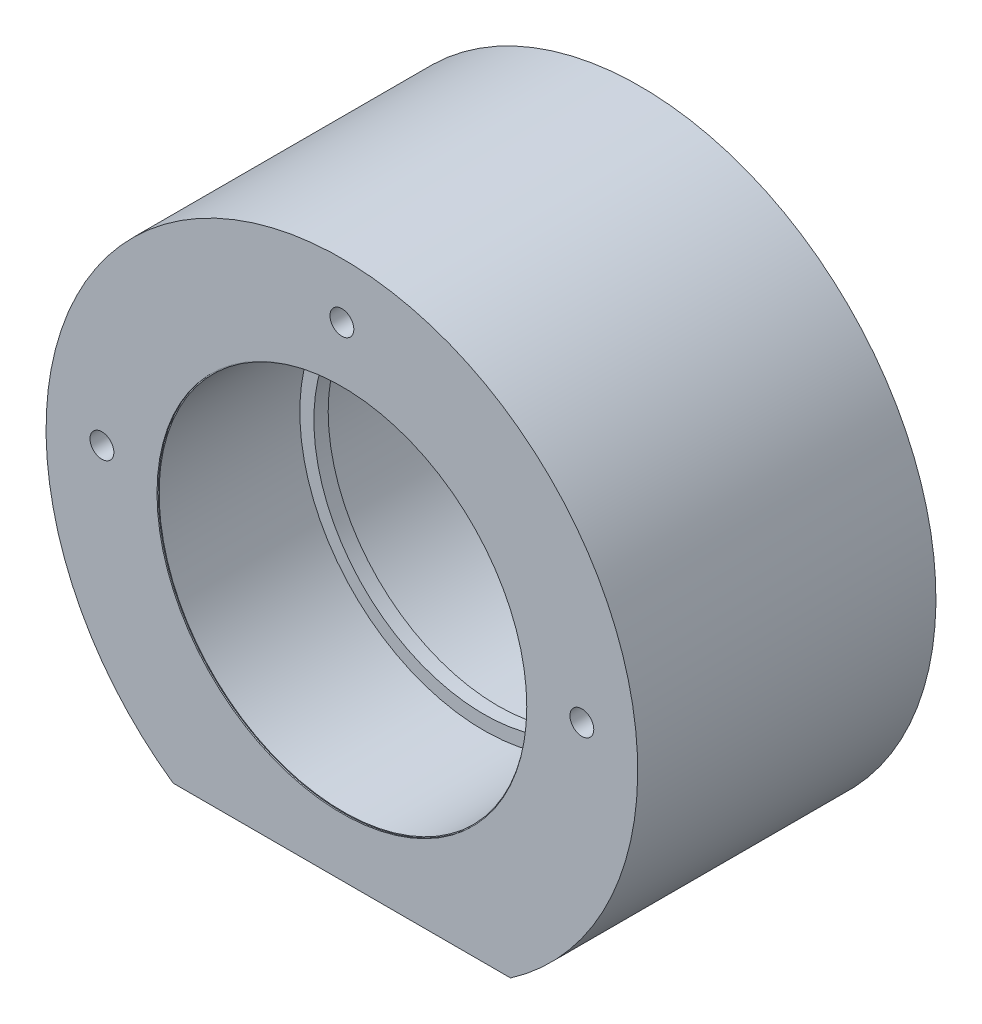
ISO-10303-21;
HEADER;
FILE_DESCRIPTION(('STEP AP214'),'2;1');
FILE_NAME('part.step','',(''),(''),'','','');
FILE_SCHEMA(('AUTOMOTIVE_DESIGN { 1 0 10303 214 1 1 1 1 }'));
ENDSEC;
DATA;
#1=APPLICATION_CONTEXT('core data for automotive mechanical design processes');
#2=APPLICATION_PROTOCOL_DEFINITION('international standard','automotive_design',2000,#1);
#3=PRODUCT_CONTEXT('',#1,'mechanical');
#4=PRODUCT('Part','Part','',(#3));
#5=PRODUCT_RELATED_PRODUCT_CATEGORY('part','',(#4));
#6=PRODUCT_DEFINITION_FORMATION('','',#4);
#7=PRODUCT_DEFINITION_CONTEXT('part definition',#1,'design');
#8=PRODUCT_DEFINITION('design','',#6,#7);
#9=PRODUCT_DEFINITION_SHAPE('','',#8);
#10=(LENGTH_UNIT() NAMED_UNIT(*) SI_UNIT(.MILLI.,.METRE.));
#11=(NAMED_UNIT(*) PLANE_ANGLE_UNIT() SI_UNIT($,.RADIAN.));
#12=(NAMED_UNIT(*) SI_UNIT($,.STERADIAN.) SOLID_ANGLE_UNIT());
#13=UNCERTAINTY_MEASURE_WITH_UNIT(LENGTH_MEASURE(1.E-05),#10,'distance_accuracy_value','');
#14=(GEOMETRIC_REPRESENTATION_CONTEXT(3) GLOBAL_UNCERTAINTY_ASSIGNED_CONTEXT((#13)) GLOBAL_UNIT_ASSIGNED_CONTEXT((#10,
#11,#12)) REPRESENTATION_CONTEXT('',''));
#15=CARTESIAN_POINT('',(0.,0.,0.));
#16=DIRECTION('',(0.,0.,1.));
#17=DIRECTION('',(1.,0.,0.));
#18=AXIS2_PLACEMENT_3D('',#15,#16,#17);
#19=CARTESIAN_POINT('',(0.,21.6034958595708,-82.4708842201519));
#20=DIRECTION('',(0.,0.,1.));
#21=DIRECTION('',(1.,0.,0.));
#22=AXIS2_PLACEMENT_3D('',#19,#20,#21);
#23=CYLINDRICAL_SURFACE('',#22,28.4985714215);
#24=CARTESIAN_POINT('',(0.,21.6034958595708,26.200714275));
#25=DIRECTION('',(0.,0.,1.));
#26=DIRECTION('',(1.,0.,0.));
#27=AXIS2_PLACEMENT_3D('',#24,#25,#26);
#28=CIRCLE('',#27,28.4985714215);
#29=CARTESIAN_POINT('',(28.4985714215,21.6034958595708,26.200714275));
#30=VERTEX_POINT('',#29);
#31=EDGE_CURVE('E101',#30,#30,#28,.F.);
#32=ORIENTED_EDGE('',*,*,#31,.F.);
#33=EDGE_LOOP('',(#32));
#34=FACE_BOUND('',#33,.T.);
#35=CARTESIAN_POINT('',(0.,21.6034958595708,23.799285725));
#36=DIRECTION('',(0.,0.,-1.));
#37=DIRECTION('',(-1.,0.,0.));
#38=AXIS2_PLACEMENT_3D('',#35,#36,#37);
#39=CIRCLE('',#38,28.4985714215);
#40=CARTESIAN_POINT('',(-28.4985714215,21.6034958595708,23.799285725));
#41=VERTEX_POINT('',#40);
#42=EDGE_CURVE('E52',#41,#41,#39,.F.);
#43=ORIENTED_EDGE('',*,*,#42,.F.);
#44=EDGE_LOOP('',(#43));
#45=FACE_BOUND('',#44,.T.);
#46=ADVANCED_FACE('F48',(#34,#45),#23,.F.);
#47=CARTESIAN_POINT('',(0.,21.6034958595708,69.285714275));
#48=DIRECTION('',(0.,0.,-1.));
#49=DIRECTION('',(-1.,0.,0.));
#50=AXIS2_PLACEMENT_3D('',#47,#48,#49);
#51=CYLINDRICAL_SURFACE('',#50,49.599999988);
#52=CARTESIAN_POINT('',(0.,21.6034958595708,50.000714275));
#53=DIRECTION('',(0.,0.,1.));
#54=DIRECTION('',(1.,0.,0.));
#55=AXIS2_PLACEMENT_3D('',#52,#53,#54);
#56=CIRCLE('',#55,49.599999988);
#57=CARTESIAN_POINT('',(28.2874458276026,-19.1393612734292,50.000714275));
#58=VERTEX_POINT('',#57);
#59=CARTESIAN_POINT('',(-28.2874458276026,-19.1393612734292,50.000714275));
#60=VERTEX_POINT('',#59);
#61=EDGE_CURVE('E64',#58,#60,#56,.T.);
#62=ORIENTED_EDGE('',*,*,#61,.F.);
#63=DIRECTION('',(0.,0.,-1.));
#64=VECTOR('',#63,1.);
#65=CARTESIAN_POINT('',(28.2874458276026,-19.1393612734292,69.285714275));
#66=LINE('',#65,#64);
#67=CARTESIAN_POINT('',(28.2874458276026,-19.1393612734292,-0.00071427499999388));
#68=VERTEX_POINT('',#67);
#69=EDGE_CURVE('E57',#58,#68,#66,.T.);
#70=ORIENTED_EDGE('',*,*,#69,.T.);
#71=CARTESIAN_POINT('',(0.,21.6034958595708,-0.000714275000000819));
#72=DIRECTION('',(0.,0.,1.));
#73=DIRECTION('',(1.,0.,0.));
#74=AXIS2_PLACEMENT_3D('',#71,#72,#73);
#75=CIRCLE('',#74,49.599999988);
#76=CARTESIAN_POINT('',(-28.2874458276026,-19.1393612734292,-0.000714275000000819));
#77=VERTEX_POINT('',#76);
#78=EDGE_CURVE('E100',#68,#77,#75,.T.);
#79=ORIENTED_EDGE('',*,*,#78,.T.);
#80=DIRECTION('',(0.,0.,-1.));
#81=VECTOR('',#80,1.);
#82=CARTESIAN_POINT('',(-28.2874458276026,-19.1393612734292,69.285714275));
#83=LINE('',#82,#81);
#84=EDGE_CURVE('E12',#60,#77,#83,.T.);
#85=ORIENTED_EDGE('',*,*,#84,.F.);
#86=EDGE_LOOP('',(#62,#70,#79,#85));
#87=FACE_BOUND('',#86,.T.);
#88=ADVANCED_FACE('F50',(#87),#51,.T.);
#89=CARTESIAN_POINT('',(-28.2874458276026,-19.1393612734292,69.285714275));
#90=DIRECTION('',(0.,1.,0.));
#91=DIRECTION('',(0.,0.,1.));
#92=AXIS2_PLACEMENT_3D('',#89,#90,#91);
#93=PLANE('',#92);
#94=DIRECTION('',(-1.,0.,0.));
#95=VECTOR('',#94,1.);
#96=CARTESIAN_POINT('',(0.,-19.1393612734292,50.000714275));
#97=LINE('',#96,#95);
#98=EDGE_CURVE('E75',#58,#60,#97,.T.);
#99=ORIENTED_EDGE('',*,*,#98,.T.);
#100=ORIENTED_EDGE('',*,*,#84,.T.);
#101=DIRECTION('',(1.,0.,0.));
#102=VECTOR('',#101,1.);
#103=CARTESIAN_POINT('',(0.,-19.1393612734292,-0.000714275000000819));
#104=LINE('',#103,#102);
#105=EDGE_CURVE('E87',#77,#68,#104,.T.);
#106=ORIENTED_EDGE('',*,*,#105,.T.);
#107=ORIENTED_EDGE('',*,*,#69,.F.);
#108=EDGE_LOOP('',(#99,#100,#106,#107));
#109=FACE_BOUND('',#108,.T.);
#110=ADVANCED_FACE('F85',(#109),#93,.F.);
#111=CARTESIAN_POINT('',(0.,21.6034958595708,49.799999994));
#112=DIRECTION('',(0.,0.,1.));
#113=DIRECTION('',(1.,0.,0.));
#114=AXIS2_PLACEMENT_3D('',#111,#112,#113);
#115=CYLINDRICAL_SURFACE('',#114,30.9999999925);
#116=CARTESIAN_POINT('',(0.,21.6034958595708,49.799999994));
#117=DIRECTION('',(0.,0.,1.));
#118=DIRECTION('',(1.,0.,0.));
#119=AXIS2_PLACEMENT_3D('',#116,#117,#118);
#120=CIRCLE('',#119,30.9999999925);
#121=CARTESIAN_POINT('',(30.9999999925,21.6034958595708,49.799999994));
#122=VERTEX_POINT('',#121);
#123=EDGE_CURVE('E88',#122,#122,#120,.T.);
#124=ORIENTED_EDGE('',*,*,#123,.F.);
#125=EDGE_LOOP('',(#124));
#126=FACE_BOUND('',#125,.T.);
#127=CARTESIAN_POINT('',(0.,21.6034958595708,50.000714275));
#128=DIRECTION('',(0.,0.,1.));
#129=DIRECTION('',(1.,0.,0.));
#130=AXIS2_PLACEMENT_3D('',#127,#128,#129);
#131=CIRCLE('',#130,30.9999999925);
#132=CARTESIAN_POINT('',(30.9999999925,21.6034958595708,50.000714275));
#133=VERTEX_POINT('',#132);
#134=EDGE_CURVE('E80',#133,#133,#131,.F.);
#135=ORIENTED_EDGE('',*,*,#134,.F.);
#136=EDGE_LOOP('',(#135));
#137=FACE_BOUND('',#136,.T.);
#138=ADVANCED_FACE('F259',(#126,#137),#115,.F.);
#139=CARTESIAN_POINT('',(0.,21.6034958595708,49.799999994));
#140=DIRECTION('',(0.,0.,1.));
#141=DIRECTION('',(1.,0.,0.));
#142=AXIS2_PLACEMENT_3D('',#139,#140,#141);
#143=PLANE('',#142);
#144=CARTESIAN_POINT('',(0.,21.6034958595708,49.799999994));
#145=DIRECTION('',(0.,0.,1.));
#146=DIRECTION('',(1.,0.,0.));
#147=AXIS2_PLACEMENT_3D('',#144,#145,#146);
#148=CIRCLE('',#147,30.85);
#149=CARTESIAN_POINT('',(30.85,21.6034958595708,49.799999994));
#150=VERTEX_POINT('',#149);
#151=EDGE_CURVE('E82',#150,#150,#148,.T.);
#152=ORIENTED_EDGE('',*,*,#151,.F.);
#153=EDGE_LOOP('',(#152));
#154=FACE_BOUND('',#153,.T.);
#155=ORIENTED_EDGE('',*,*,#123,.T.);
#156=EDGE_LOOP('',(#155));
#157=FACE_BOUND('',#156,.T.);
#158=ADVANCED_FACE('F143',(#154,#157),#143,.T.);
#159=CARTESIAN_POINT('',(0.,21.6034958595708,0.200000005999997));
#160=DIRECTION('',(0.,0.,-1.));
#161=DIRECTION('',(-1.,0.,0.));
#162=AXIS2_PLACEMENT_3D('',#159,#160,#161);
#163=CYLINDRICAL_SURFACE('',#162,30.9999999925);
#164=CARTESIAN_POINT('',(0.,21.6034958595708,-0.000714275000000819));
#165=DIRECTION('',(0.,0.,1.));
#166=DIRECTION('',(1.,0.,0.));
#167=AXIS2_PLACEMENT_3D('',#164,#165,#166);
#168=CIRCLE('',#167,30.9999999925);
#169=CARTESIAN_POINT('',(30.9999999925,21.6034958595708,-0.000714275000000819));
#170=VERTEX_POINT('',#169);
#171=EDGE_CURVE('E95',#170,#170,#168,.T.);
#172=ORIENTED_EDGE('',*,*,#171,.F.);
#173=EDGE_LOOP('',(#172));
#174=FACE_BOUND('',#173,.T.);
#175=CARTESIAN_POINT('',(0.,21.6034958595708,0.200000005999997));
#176=DIRECTION('',(0.,0.,1.));
#177=DIRECTION('',(1.,0.,0.));
#178=AXIS2_PLACEMENT_3D('',#175,#176,#177);
#179=CIRCLE('',#178,30.9999999925);
#180=CARTESIAN_POINT('',(30.9999999925,21.6034958595708,0.200000005999997));
#181=VERTEX_POINT('',#180);
#182=EDGE_CURVE('E91',#181,#181,#179,.T.);
#183=ORIENTED_EDGE('',*,*,#182,.T.);
#184=EDGE_LOOP('',(#183));
#185=FACE_BOUND('',#184,.T.);
#186=ADVANCED_FACE('F130',(#174,#185),#163,.F.);
#187=CARTESIAN_POINT('',(0.,21.6034958595708,0.200000005999997));
#188=DIRECTION('',(0.,0.,-1.));
#189=DIRECTION('',(1.,0.,0.));
#190=AXIS2_PLACEMENT_3D('',#187,#188,#189);
#191=PLANE('',#190);
#192=CARTESIAN_POINT('',(0.,21.6034958595708,0.200000005999998));
#193=DIRECTION('',(0.,0.,-1.));
#194=DIRECTION('',(-1.,0.,0.));
#195=AXIS2_PLACEMENT_3D('',#192,#193,#194);
#196=CIRCLE('',#195,30.85);
#197=CARTESIAN_POINT('',(-30.85,21.6034958595708,0.200000005999998));
#198=VERTEX_POINT('',#197);
#199=EDGE_CURVE('E106',#198,#198,#196,.F.);
#200=ORIENTED_EDGE('',*,*,#199,.T.);
#201=EDGE_LOOP('',(#200));
#202=FACE_BOUND('',#201,.T.);
#203=ORIENTED_EDGE('',*,*,#182,.F.);
#204=EDGE_LOOP('',(#203));
#205=FACE_BOUND('',#204,.T.);
#206=ADVANCED_FACE('F132',(#202,#205),#191,.T.);
#207=CARTESIAN_POINT('',(0.,21.6034958595708,-0.000714275000000819));
#208=DIRECTION('',(0.,0.,1.));
#209=DIRECTION('',(1.,0.,0.));
#210=AXIS2_PLACEMENT_3D('',#207,#208,#209);
#211=PLANE('',#210);
#212=CARTESIAN_POINT('',(-40.2334024909348,23.9193810040543,-0.000714275000000819));
#213=DIRECTION('',(0.,0.,1.));
#214=DIRECTION('',(1.,0.,0.));
#215=AXIS2_PLACEMENT_3D('',#212,#213,#214);
#216=CIRCLE('',#215,2.);
#217=CARTESIAN_POINT('',(-38.2334024909348,23.9193810040543,-0.000714275000001686));
#218=VERTEX_POINT('',#217);
#219=EDGE_CURVE('E113',#218,#218,#216,.F.);
#220=ORIENTED_EDGE('',*,*,#219,.F.);
#221=EDGE_LOOP('',(#220));
#222=FACE_BOUND('',#221,.T.);
#223=CARTESIAN_POINT('',(40.2334007714421,23.9194108762585,-0.000714275000000819));
#224=DIRECTION('',(0.,0.,1.));
#225=DIRECTION('',(1.,0.,0.));
#226=AXIS2_PLACEMENT_3D('',#223,#224,#225);
#227=CIRCLE('',#226,2.);
#228=CARTESIAN_POINT('',(42.2334007714421,23.9194108762585,-0.000714275000001686));
#229=VERTEX_POINT('',#228);
#230=EDGE_CURVE('E194',#229,#229,#227,.F.);
#231=ORIENTED_EDGE('',*,*,#230,.F.);
#232=EDGE_LOOP('',(#231));
#233=FACE_BOUND('',#232,.T.);
#234=CARTESIAN_POINT('',(0.,61.9034958595708,-0.000714275000000819));
#235=DIRECTION('',(0.,0.,1.));
#236=DIRECTION('',(1.,0.,0.));
#237=AXIS2_PLACEMENT_3D('',#234,#235,#236);
#238=CIRCLE('',#237,2.);
#239=CARTESIAN_POINT('',(2.,61.9034958595708,-0.000714275000001686));
#240=VERTEX_POINT('',#239);
#241=EDGE_CURVE('E198',#240,#240,#238,.F.);
#242=ORIENTED_EDGE('',*,*,#241,.F.);
#243=EDGE_LOOP('',(#242));
#244=FACE_BOUND('',#243,.T.);
#245=ORIENTED_EDGE('',*,*,#171,.T.);
#246=EDGE_LOOP('',(#245));
#247=FACE_BOUND('',#246,.T.);
#248=ORIENTED_EDGE('',*,*,#78,.F.);
#249=ORIENTED_EDGE('',*,*,#105,.F.);
#250=EDGE_LOOP('',(#248,#249));
#251=FACE_BOUND('',#250,.T.);
#252=ADVANCED_FACE('F134',(#222,#233,#244,#247,#251),#211,.F.);
#253=CARTESIAN_POINT('',(0.,21.6034958595708,50.000714275));
#254=DIRECTION('',(0.,0.,1.));
#255=DIRECTION('',(1.,0.,0.));
#256=AXIS2_PLACEMENT_3D('',#253,#254,#255);
#257=PLANE('',#256);
#258=CARTESIAN_POINT('',(-40.2334024909348,23.9193810040543,50.000714275));
#259=DIRECTION('',(0.,0.,1.));
#260=DIRECTION('',(1.,0.,0.));
#261=AXIS2_PLACEMENT_3D('',#258,#259,#260);
#262=CIRCLE('',#261,2.);
#263=CARTESIAN_POINT('',(-38.2334024909348,23.9193810040543,50.000714275));
#264=VERTEX_POINT('',#263);
#265=EDGE_CURVE('E118',#264,#264,#262,.T.);
#266=ORIENTED_EDGE('',*,*,#265,.F.);
#267=EDGE_LOOP('',(#266));
#268=FACE_BOUND('',#267,.T.);
#269=CARTESIAN_POINT('',(40.2334007714421,23.9194108762585,50.000714275));
#270=DIRECTION('',(0.,0.,1.));
#271=DIRECTION('',(1.,0.,0.));
#272=AXIS2_PLACEMENT_3D('',#269,#270,#271);
#273=CIRCLE('',#272,2.);
#274=CARTESIAN_POINT('',(42.2334007714421,23.9194108762585,50.000714275));
#275=VERTEX_POINT('',#274);
#276=EDGE_CURVE('E191',#275,#275,#273,.T.);
#277=ORIENTED_EDGE('',*,*,#276,.F.);
#278=EDGE_LOOP('',(#277));
#279=FACE_BOUND('',#278,.T.);
#280=CARTESIAN_POINT('',(0.,61.9034958595708,50.000714275));
#281=DIRECTION('',(0.,0.,1.));
#282=DIRECTION('',(1.,0.,0.));
#283=AXIS2_PLACEMENT_3D('',#280,#281,#282);
#284=CIRCLE('',#283,2.);
#285=CARTESIAN_POINT('',(2.,61.9034958595708,50.000714275));
#286=VERTEX_POINT('',#285);
#287=EDGE_CURVE('E122',#286,#286,#284,.T.);
#288=ORIENTED_EDGE('',*,*,#287,.F.);
#289=EDGE_LOOP('',(#288));
#290=FACE_BOUND('',#289,.T.);
#291=ORIENTED_EDGE('',*,*,#61,.T.);
#292=ORIENTED_EDGE('',*,*,#98,.F.);
#293=EDGE_LOOP('',(#291,#292));
#294=FACE_BOUND('',#293,.T.);
#295=ORIENTED_EDGE('',*,*,#134,.T.);
#296=EDGE_LOOP('',(#295));
#297=FACE_BOUND('',#296,.T.);
#298=ADVANCED_FACE('F76',(#268,#279,#290,#294,#297),#257,.T.);
#299=CARTESIAN_POINT('',(0.,21.6034958595708,26.200714275));
#300=DIRECTION('',(0.,0.,1.));
#301=DIRECTION('',(1.,0.,0.));
#302=AXIS2_PLACEMENT_3D('',#299,#300,#301);
#303=PLANE('',#302);
#304=CARTESIAN_POINT('',(0.,21.6034958595708,26.200714275));
#305=DIRECTION('',(0.,0.,1.));
#306=DIRECTION('',(1.,0.,0.));
#307=AXIS2_PLACEMENT_3D('',#304,#305,#306);
#308=CIRCLE('',#307,30.85);
#309=CARTESIAN_POINT('',(30.85,21.6034958595708,26.200714275));
#310=VERTEX_POINT('',#309);
#311=EDGE_CURVE('E104',#310,#310,#308,.T.);
#312=ORIENTED_EDGE('',*,*,#311,.T.);
#313=EDGE_LOOP('',(#312));
#314=FACE_BOUND('',#313,.T.);
#315=ORIENTED_EDGE('',*,*,#31,.T.);
#316=EDGE_LOOP('',(#315));
#317=FACE_BOUND('',#316,.T.);
#318=ADVANCED_FACE('F157',(#314,#317),#303,.T.);
#319=CARTESIAN_POINT('',(0.,21.6034958595708,26.200714275));
#320=DIRECTION('',(0.,0.,1.));
#321=DIRECTION('',(1.,0.,0.));
#322=AXIS2_PLACEMENT_3D('',#319,#320,#321);
#323=CYLINDRICAL_SURFACE('',#322,30.85);
#324=ORIENTED_EDGE('',*,*,#151,.T.);
#325=EDGE_LOOP('',(#324));
#326=FACE_BOUND('',#325,.T.);
#327=ORIENTED_EDGE('',*,*,#311,.F.);
#328=EDGE_LOOP('',(#327));
#329=FACE_BOUND('',#328,.T.);
#330=ADVANCED_FACE('F159',(#326,#329),#323,.F.);
#331=CARTESIAN_POINT('',(0.,21.6034958595708,23.799285725));
#332=DIRECTION('',(0.,0.,-1.));
#333=DIRECTION('',(1.,0.,0.));
#334=AXIS2_PLACEMENT_3D('',#331,#332,#333);
#335=PLANE('',#334);
#336=CARTESIAN_POINT('',(0.,21.6034958595708,23.799285725));
#337=DIRECTION('',(0.,0.,1.));
#338=DIRECTION('',(1.,0.,0.));
#339=AXIS2_PLACEMENT_3D('',#336,#337,#338);
#340=CIRCLE('',#339,30.85);
#341=CARTESIAN_POINT('',(30.85,21.6034958595708,23.799285725));
#342=VERTEX_POINT('',#341);
#343=EDGE_CURVE('E108',#342,#342,#340,.T.);
#344=ORIENTED_EDGE('',*,*,#343,.F.);
#345=EDGE_LOOP('',(#344));
#346=FACE_BOUND('',#345,.T.);
#347=ORIENTED_EDGE('',*,*,#42,.T.);
#348=EDGE_LOOP('',(#347));
#349=FACE_BOUND('',#348,.T.);
#350=ADVANCED_FACE('F162',(#346,#349),#335,.T.);
#351=CARTESIAN_POINT('',(0.,21.6034958595708,23.799285725));
#352=DIRECTION('',(0.,0.,-1.));
#353=DIRECTION('',(-1.,0.,0.));
#354=AXIS2_PLACEMENT_3D('',#351,#352,#353);
#355=CYLINDRICAL_SURFACE('',#354,30.85);
#356=ORIENTED_EDGE('',*,*,#199,.F.);
#357=EDGE_LOOP('',(#356));
#358=FACE_BOUND('',#357,.T.);
#359=ORIENTED_EDGE('',*,*,#343,.T.);
#360=EDGE_LOOP('',(#359));
#361=FACE_BOUND('',#360,.T.);
#362=ADVANCED_FACE('F167',(#358,#361),#355,.F.);
#363=CARTESIAN_POINT('',(0.,61.9034958595708,-5.65756852449239));
#364=DIRECTION('',(0.,0.,1.));
#365=DIRECTION('',(1.,0.,0.));
#366=AXIS2_PLACEMENT_3D('',#363,#364,#365);
#367=CYLINDRICAL_SURFACE('',#366,2.);
#368=CARTESIAN_POINT('',(2.,61.9034958595708,50.000714275));
#369=CARTESIAN_POINT('',(2.,61.9034958595708,49.4798660609375));
#370=CARTESIAN_POINT('',(2.,61.9034958595708,48.959017846875));
#371=CARTESIAN_POINT('',(2.,61.9034958595708,47.91732141875));
#372=CARTESIAN_POINT('',(2.,61.9034958595708,47.3964732046875));
#373=CARTESIAN_POINT('',(2.,61.9034958595708,46.3547767765625));
#374=CARTESIAN_POINT('',(2.,61.9034958595708,45.8339285625));
#375=CARTESIAN_POINT('',(2.,61.9034958595708,44.792232134375));
#376=CARTESIAN_POINT('',(2.,61.9034958595708,44.2713839203125));
#377=CARTESIAN_POINT('',(2.,61.9034958595708,43.2296874921875));
#378=CARTESIAN_POINT('',(2.,61.9034958595708,42.708839278125));
#379=CARTESIAN_POINT('',(2.,61.9034958595708,41.66714285));
#380=CARTESIAN_POINT('',(2.,61.9034958595708,41.1462946359375));
#381=CARTESIAN_POINT('',(2.,61.9034958595708,40.1045982078125));
#382=CARTESIAN_POINT('',(2.,61.9034958595708,39.58374999375));
#383=CARTESIAN_POINT('',(2.,61.9034958595708,38.542053565625));
#384=CARTESIAN_POINT('',(2.,61.9034958595708,38.0212053515625));
#385=CARTESIAN_POINT('',(2.,61.9034958595708,36.9795089234375));
#386=CARTESIAN_POINT('',(2.,61.9034958595708,36.458660709375));
#387=CARTESIAN_POINT('',(2.,61.9034958595708,35.41696428125));
#388=CARTESIAN_POINT('',(2.,61.9034958595708,34.8961160671875));
#389=CARTESIAN_POINT('',(2.,61.9034958595708,33.8544196390625));
#390=CARTESIAN_POINT('',(2.,61.9034958595708,33.333571425));
#391=CARTESIAN_POINT('',(2.,61.9034958595708,32.291874996875));
#392=CARTESIAN_POINT('',(2.,61.9034958595708,31.7710267828125));
#393=CARTESIAN_POINT('',(2.,61.9034958595708,30.7293303546875));
#394=CARTESIAN_POINT('',(2.,61.9034958595708,30.208482140625));
#395=CARTESIAN_POINT('',(2.,61.9034958595708,29.1667857125));
#396=CARTESIAN_POINT('',(2.,61.9034958595708,28.6459374984375));
#397=CARTESIAN_POINT('',(2.,61.9034958595708,27.6042410703125));
#398=CARTESIAN_POINT('',(2.,61.9034958595708,27.08339285625));
#399=CARTESIAN_POINT('',(2.,61.9034958595708,26.041696428125));
#400=CARTESIAN_POINT('',(2.,61.9034958595708,25.5208482140625));
#401=CARTESIAN_POINT('',(2.,61.9034958595708,24.4791517859375));
#402=CARTESIAN_POINT('',(2.,61.9034958595708,23.958303571875));
#403=CARTESIAN_POINT('',(2.,61.9034958595708,22.91660714375));
#404=CARTESIAN_POINT('',(2.,61.9034958595708,22.3957589296875));
#405=CARTESIAN_POINT('',(2.,61.9034958595708,21.3540625015625));
#406=CARTESIAN_POINT('',(2.,61.9034958595708,20.8332142875));
#407=CARTESIAN_POINT('',(2.,61.9034958595708,19.791517859375));
#408=CARTESIAN_POINT('',(2.,61.9034958595708,19.2706696453125));
#409=CARTESIAN_POINT('',(2.,61.9034958595708,18.2289732171875));
#410=CARTESIAN_POINT('',(2.,61.9034958595708,17.708125003125));
#411=CARTESIAN_POINT('',(2.,61.9034958595708,16.666428575));
#412=CARTESIAN_POINT('',(2.,61.9034958595708,16.1455803609375));
#413=CARTESIAN_POINT('',(2.,61.9034958595708,15.1038839328125));
#414=CARTESIAN_POINT('',(2.,61.9034958595708,14.58303571875));
#415=CARTESIAN_POINT('',(2.,61.9034958595708,13.541339290625));
#416=CARTESIAN_POINT('',(2.,61.9034958595708,13.0204910765625));
#417=CARTESIAN_POINT('',(2.,61.9034958595708,11.9787946484375));
#418=CARTESIAN_POINT('',(2.,61.9034958595708,11.457946434375));
#419=CARTESIAN_POINT('',(2.,61.9034958595708,10.41625000625));
#420=CARTESIAN_POINT('',(2.,61.9034958595708,9.8954017921875));
#421=CARTESIAN_POINT('',(2.,61.9034958595708,8.8537053640625));
#422=CARTESIAN_POINT('',(2.,61.9034958595708,8.33285715));
#423=CARTESIAN_POINT('',(2.,61.9034958595708,7.291160721875));
#424=CARTESIAN_POINT('',(2.,61.9034958595708,6.7703125078125));
#425=CARTESIAN_POINT('',(2.,61.9034958595708,5.7286160796875));
#426=CARTESIAN_POINT('',(2.,61.9034958595708,5.207767865625));
#427=CARTESIAN_POINT('',(2.,61.9034958595708,4.1660714375));
#428=CARTESIAN_POINT('',(2.,61.9034958595708,3.6452232234375));
#429=CARTESIAN_POINT('',(2.,61.9034958595708,2.6035267953125));
#430=CARTESIAN_POINT('',(2.,61.9034958595708,2.08267858125));
#431=CARTESIAN_POINT('',(2.,61.9034958595708,1.040982153125));
#432=CARTESIAN_POINT('',(2.,61.9034958595708,0.5201339390625));
#433=CARTESIAN_POINT('',(2.,61.9034958595708,-0.000714275000001686));
#434=B_SPLINE_CURVE_WITH_KNOTS('',3,(#368,#369,#370,#371,#372,#373,#374,#375,#376,#377,#378,
#379,#380,#381,#382,#383,#384,#385,#386,#387,#388,#389,#390,#391,#392,#393,#394,#395,#396,#397,
#398,#399,#400,#401,#402,#403,#404,#405,#406,#407,#408,#409,#410,#411,#412,#413,#414,#415,#416,
#417,#418,#419,#420,#421,#422,#423,#424,#425,#426,#427,#428,#429,#430,#431,#432,#433),
.UNSPECIFIED.,.F.,.F.,(4,2,2,2,2,2,2,2,2,2,2,2,2,2,2,2,2,2,2,2,2,2,2,2,2,2,2,2,2,2,2,2,4),(0.,
1.5625446421875,3.125089284375,4.6876339265625,6.25017856875,7.8127232109375,9.37526785312501,
10.9378124953125,12.5003571375,14.0629017796875,15.625446421875,17.1879910640625,18.75053570625,
20.3130803484375,21.875624990625,23.4381696328125,25.000714275,26.5632589171875,28.125803559375,
29.6883482015625,31.25089284375,32.8134374859375,34.375982128125,35.9385267703125,37.5010714125,
39.0636160546875,40.626160696875,42.1887053390625,43.75124998125,45.3137946234375,
46.876339265625,48.4388839078125,50.00142855),.UNSPECIFIED.);
#435=EDGE_CURVE('BSEAM170',#286,#240,#434,.T.);
#436=ORIENTED_EDGE('',*,*,#287,.T.);
#437=ORIENTED_EDGE('',*,*,#241,.T.);
#438=ORIENTED_EDGE('',*,*,#435,.T.);
#439=ORIENTED_EDGE('',*,*,#435,.F.);
#440=EDGE_LOOP('',(#436,#438,#437,#439));
#441=FACE_BOUND('',#440,.T.);
#442=ADVANCED_FACE('F170',(#441),#367,.F.);
#443=CARTESIAN_POINT('',(40.2334007714421,23.9194108762585,-5.65756852449239));
#444=DIRECTION('',(0.,0.,1.));
#445=DIRECTION('',(1.,0.,0.));
#446=AXIS2_PLACEMENT_3D('',#443,#444,#445);
#447=CYLINDRICAL_SURFACE('',#446,2.);
#448=CARTESIAN_POINT('',(42.2334007714421,23.9194108762585,-0.000714275000001686));
#449=CARTESIAN_POINT('',(42.2334007714421,23.9194108762585,0.520133939062499));
#450=CARTESIAN_POINT('',(42.2334007714421,23.9194108762585,1.040982153125));
#451=CARTESIAN_POINT('',(42.2334007714421,23.9194108762585,2.08267858125));
#452=CARTESIAN_POINT('',(42.2334007714421,23.9194108762585,2.6035267953125));
#453=CARTESIAN_POINT('',(42.2334007714421,23.9194108762585,3.6452232234375));
#454=CARTESIAN_POINT('',(42.2334007714421,23.9194108762585,4.1660714375));
#455=CARTESIAN_POINT('',(42.2334007714421,23.9194108762585,5.207767865625));
#456=CARTESIAN_POINT('',(42.2334007714421,23.9194108762585,5.7286160796875));
#457=CARTESIAN_POINT('',(42.2334007714421,23.9194108762585,6.7703125078125));
#458=CARTESIAN_POINT('',(42.2334007714421,23.9194108762585,7.291160721875));
#459=CARTESIAN_POINT('',(42.2334007714421,23.9194108762585,8.33285715));
#460=CARTESIAN_POINT('',(42.2334007714421,23.9194108762585,8.8537053640625));
#461=CARTESIAN_POINT('',(42.2334007714421,23.9194108762585,9.8954017921875));
#462=CARTESIAN_POINT('',(42.2334007714421,23.9194108762585,10.41625000625));
#463=CARTESIAN_POINT('',(42.2334007714421,23.9194108762585,11.457946434375));
#464=CARTESIAN_POINT('',(42.2334007714421,23.9194108762585,11.9787946484375));
#465=CARTESIAN_POINT('',(42.2334007714421,23.9194108762585,13.0204910765625));
#466=CARTESIAN_POINT('',(42.2334007714421,23.9194108762585,13.541339290625));
#467=CARTESIAN_POINT('',(42.2334007714421,23.9194108762585,14.58303571875));
#468=CARTESIAN_POINT('',(42.2334007714421,23.9194108762585,15.1038839328125));
#469=CARTESIAN_POINT('',(42.2334007714421,23.9194108762585,16.1455803609375));
#470=CARTESIAN_POINT('',(42.2334007714421,23.9194108762585,16.666428575));
#471=CARTESIAN_POINT('',(42.2334007714421,23.9194108762585,17.708125003125));
#472=CARTESIAN_POINT('',(42.2334007714421,23.9194108762585,18.2289732171875));
#473=CARTESIAN_POINT('',(42.2334007714421,23.9194108762585,19.2706696453125));
#474=CARTESIAN_POINT('',(42.2334007714421,23.9194108762585,19.791517859375));
#475=CARTESIAN_POINT('',(42.2334007714421,23.9194108762585,20.8332142875));
#476=CARTESIAN_POINT('',(42.2334007714421,23.9194108762585,21.3540625015625));
#477=CARTESIAN_POINT('',(42.2334007714421,23.9194108762585,22.3957589296875));
#478=CARTESIAN_POINT('',(42.2334007714421,23.9194108762585,22.91660714375));
#479=CARTESIAN_POINT('',(42.2334007714421,23.9194108762585,23.958303571875));
#480=CARTESIAN_POINT('',(42.2334007714421,23.9194108762585,24.4791517859375));
#481=CARTESIAN_POINT('',(42.2334007714421,23.9194108762585,25.5208482140625));
#482=CARTESIAN_POINT('',(42.2334007714421,23.9194108762585,26.041696428125));
#483=CARTESIAN_POINT('',(42.2334007714421,23.9194108762585,27.08339285625));
#484=CARTESIAN_POINT('',(42.2334007714421,23.9194108762585,27.6042410703125));
#485=CARTESIAN_POINT('',(42.2334007714421,23.9194108762585,28.6459374984375));
#486=CARTESIAN_POINT('',(42.2334007714421,23.9194108762585,29.1667857125));
#487=CARTESIAN_POINT('',(42.2334007714421,23.9194108762585,30.208482140625));
#488=CARTESIAN_POINT('',(42.2334007714421,23.9194108762585,30.7293303546875));
#489=CARTESIAN_POINT('',(42.2334007714421,23.9194108762585,31.7710267828125));
#490=CARTESIAN_POINT('',(42.2334007714421,23.9194108762585,32.291874996875));
#491=CARTESIAN_POINT('',(42.2334007714421,23.9194108762585,33.333571425));
#492=CARTESIAN_POINT('',(42.2334007714421,23.9194108762585,33.8544196390625));
#493=CARTESIAN_POINT('',(42.2334007714421,23.9194108762585,34.8961160671875));
#494=CARTESIAN_POINT('',(42.2334007714421,23.9194108762585,35.41696428125));
#495=CARTESIAN_POINT('',(42.2334007714421,23.9194108762585,36.458660709375));
#496=CARTESIAN_POINT('',(42.2334007714421,23.9194108762585,36.9795089234375));
#497=CARTESIAN_POINT('',(42.2334007714421,23.9194108762585,38.0212053515625));
#498=CARTESIAN_POINT('',(42.2334007714421,23.9194108762585,38.542053565625));
#499=CARTESIAN_POINT('',(42.2334007714421,23.9194108762585,39.58374999375));
#500=CARTESIAN_POINT('',(42.2334007714421,23.9194108762585,40.1045982078125));
#501=CARTESIAN_POINT('',(42.2334007714421,23.9194108762585,41.1462946359375));
#502=CARTESIAN_POINT('',(42.2334007714421,23.9194108762585,41.66714285));
#503=CARTESIAN_POINT('',(42.2334007714421,23.9194108762585,42.708839278125));
#504=CARTESIAN_POINT('',(42.2334007714421,23.9194108762585,43.2296874921875));
#505=CARTESIAN_POINT('',(42.2334007714421,23.9194108762585,44.2713839203125));
#506=CARTESIAN_POINT('',(42.2334007714421,23.9194108762585,44.792232134375));
#507=CARTESIAN_POINT('',(42.2334007714421,23.9194108762585,45.8339285625));
#508=CARTESIAN_POINT('',(42.2334007714421,23.9194108762585,46.3547767765625));
#509=CARTESIAN_POINT('',(42.2334007714421,23.9194108762585,47.3964732046875));
#510=CARTESIAN_POINT('',(42.2334007714421,23.9194108762585,47.91732141875));
#511=CARTESIAN_POINT('',(42.2334007714421,23.9194108762585,48.959017846875));
#512=CARTESIAN_POINT('',(42.2334007714421,23.9194108762585,49.4798660609375));
#513=CARTESIAN_POINT('',(42.2334007714421,23.9194108762585,50.000714275));
#514=B_SPLINE_CURVE_WITH_KNOTS('',3,(#448,#449,#450,#451,#452,#453,#454,#455,#456,#457,#458,
#459,#460,#461,#462,#463,#464,#465,#466,#467,#468,#469,#470,#471,#472,#473,#474,#475,#476,#477,
#478,#479,#480,#481,#482,#483,#484,#485,#486,#487,#488,#489,#490,#491,#492,#493,#494,#495,#496,
#497,#498,#499,#500,#501,#502,#503,#504,#505,#506,#507,#508,#509,#510,#511,#512,#513),
.UNSPECIFIED.,.F.,.F.,(4,2,2,2,2,2,2,2,2,2,2,2,2,2,2,2,2,2,2,2,2,2,2,2,2,2,2,2,2,2,2,2,4),(0.,
1.5625446421875,3.125089284375,4.6876339265625,6.25017856875,7.8127232109375,9.375267853125,
10.9378124953125,12.5003571375,14.0629017796875,15.625446421875,17.1879910640625,18.75053570625,
20.3130803484375,21.875624990625,23.4381696328125,25.000714275,26.5632589171875,28.125803559375,
29.6883482015625,31.25089284375,32.8134374859375,34.375982128125,35.9385267703125,37.5010714125,
39.0636160546875,40.626160696875,42.1887053390625,43.75124998125,45.3137946234375,
46.876339265625,48.4388839078125,50.00142855),.UNSPECIFIED.);
#515=EDGE_CURVE('BSEAM177',#229,#275,#514,.T.);
#516=ORIENTED_EDGE('',*,*,#230,.T.);
#517=ORIENTED_EDGE('',*,*,#276,.T.);
#518=ORIENTED_EDGE('',*,*,#515,.T.);
#519=ORIENTED_EDGE('',*,*,#515,.F.);
#520=EDGE_LOOP('',(#516,#518,#517,#519));
#521=FACE_BOUND('',#520,.T.);
#522=ADVANCED_FACE('F177',(#521),#447,.F.);
#523=CARTESIAN_POINT('',(-40.2334024909348,23.9193810040543,-5.65756852449239));
#524=DIRECTION('',(0.,0.,1.));
#525=DIRECTION('',(1.,0.,0.));
#526=AXIS2_PLACEMENT_3D('',#523,#524,#525);
#527=CYLINDRICAL_SURFACE('',#526,2.);
#528=CARTESIAN_POINT('',(-38.2334024909348,23.9193810040543,-0.000714275000001686));
#529=CARTESIAN_POINT('',(-38.2334024909348,23.9193810040543,0.520133939062499));
#530=CARTESIAN_POINT('',(-38.2334024909348,23.9193810040543,1.040982153125));
#531=CARTESIAN_POINT('',(-38.2334024909348,23.9193810040543,2.08267858125));
#532=CARTESIAN_POINT('',(-38.2334024909348,23.9193810040543,2.6035267953125));
#533=CARTESIAN_POINT('',(-38.2334024909348,23.9193810040543,3.6452232234375));
#534=CARTESIAN_POINT('',(-38.2334024909348,23.9193810040543,4.1660714375));
#535=CARTESIAN_POINT('',(-38.2334024909348,23.9193810040543,5.207767865625));
#536=CARTESIAN_POINT('',(-38.2334024909348,23.9193810040543,5.7286160796875));
#537=CARTESIAN_POINT('',(-38.2334024909348,23.9193810040543,6.7703125078125));
#538=CARTESIAN_POINT('',(-38.2334024909348,23.9193810040543,7.291160721875));
#539=CARTESIAN_POINT('',(-38.2334024909348,23.9193810040543,8.33285715));
#540=CARTESIAN_POINT('',(-38.2334024909348,23.9193810040543,8.8537053640625));
#541=CARTESIAN_POINT('',(-38.2334024909348,23.9193810040543,9.8954017921875));
#542=CARTESIAN_POINT('',(-38.2334024909348,23.9193810040543,10.41625000625));
#543=CARTESIAN_POINT('',(-38.2334024909348,23.9193810040543,11.457946434375));
#544=CARTESIAN_POINT('',(-38.2334024909348,23.9193810040543,11.9787946484375));
#545=CARTESIAN_POINT('',(-38.2334024909348,23.9193810040543,13.0204910765625));
#546=CARTESIAN_POINT('',(-38.2334024909348,23.9193810040543,13.541339290625));
#547=CARTESIAN_POINT('',(-38.2334024909348,23.9193810040543,14.58303571875));
#548=CARTESIAN_POINT('',(-38.2334024909348,23.9193810040543,15.1038839328125));
#549=CARTESIAN_POINT('',(-38.2334024909348,23.9193810040543,16.1455803609375));
#550=CARTESIAN_POINT('',(-38.2334024909348,23.9193810040543,16.666428575));
#551=CARTESIAN_POINT('',(-38.2334024909348,23.9193810040543,17.708125003125));
#552=CARTESIAN_POINT('',(-38.2334024909348,23.9193810040543,18.2289732171875));
#553=CARTESIAN_POINT('',(-38.2334024909348,23.9193810040543,19.2706696453125));
#554=CARTESIAN_POINT('',(-38.2334024909348,23.9193810040543,19.791517859375));
#555=CARTESIAN_POINT('',(-38.2334024909348,23.9193810040543,20.8332142875));
#556=CARTESIAN_POINT('',(-38.2334024909348,23.9193810040543,21.3540625015625));
#557=CARTESIAN_POINT('',(-38.2334024909348,23.9193810040543,22.3957589296875));
#558=CARTESIAN_POINT('',(-38.2334024909348,23.9193810040543,22.91660714375));
#559=CARTESIAN_POINT('',(-38.2334024909348,23.9193810040543,23.958303571875));
#560=CARTESIAN_POINT('',(-38.2334024909348,23.9193810040543,24.4791517859375));
#561=CARTESIAN_POINT('',(-38.2334024909348,23.9193810040543,25.5208482140625));
#562=CARTESIAN_POINT('',(-38.2334024909348,23.9193810040543,26.041696428125));
#563=CARTESIAN_POINT('',(-38.2334024909348,23.9193810040543,27.08339285625));
#564=CARTESIAN_POINT('',(-38.2334024909348,23.9193810040543,27.6042410703125));
#565=CARTESIAN_POINT('',(-38.2334024909348,23.9193810040543,28.6459374984375));
#566=CARTESIAN_POINT('',(-38.2334024909348,23.9193810040543,29.1667857125));
#567=CARTESIAN_POINT('',(-38.2334024909348,23.9193810040543,30.208482140625));
#568=CARTESIAN_POINT('',(-38.2334024909348,23.9193810040543,30.7293303546875));
#569=CARTESIAN_POINT('',(-38.2334024909348,23.9193810040543,31.7710267828125));
#570=CARTESIAN_POINT('',(-38.2334024909348,23.9193810040543,32.291874996875));
#571=CARTESIAN_POINT('',(-38.2334024909348,23.9193810040543,33.333571425));
#572=CARTESIAN_POINT('',(-38.2334024909348,23.9193810040543,33.8544196390625));
#573=CARTESIAN_POINT('',(-38.2334024909348,23.9193810040543,34.8961160671875));
#574=CARTESIAN_POINT('',(-38.2334024909348,23.9193810040543,35.41696428125));
#575=CARTESIAN_POINT('',(-38.2334024909348,23.9193810040543,36.458660709375));
#576=CARTESIAN_POINT('',(-38.2334024909348,23.9193810040543,36.9795089234375));
#577=CARTESIAN_POINT('',(-38.2334024909348,23.9193810040543,38.0212053515625));
#578=CARTESIAN_POINT('',(-38.2334024909348,23.9193810040543,38.542053565625));
#579=CARTESIAN_POINT('',(-38.2334024909348,23.9193810040543,39.58374999375));
#580=CARTESIAN_POINT('',(-38.2334024909348,23.9193810040543,40.1045982078125));
#581=CARTESIAN_POINT('',(-38.2334024909348,23.9193810040543,41.1462946359375));
#582=CARTESIAN_POINT('',(-38.2334024909348,23.9193810040543,41.66714285));
#583=CARTESIAN_POINT('',(-38.2334024909348,23.9193810040543,42.708839278125));
#584=CARTESIAN_POINT('',(-38.2334024909348,23.9193810040543,43.2296874921875));
#585=CARTESIAN_POINT('',(-38.2334024909348,23.9193810040543,44.2713839203125));
#586=CARTESIAN_POINT('',(-38.2334024909348,23.9193810040543,44.792232134375));
#587=CARTESIAN_POINT('',(-38.2334024909348,23.9193810040543,45.8339285625));
#588=CARTESIAN_POINT('',(-38.2334024909348,23.9193810040543,46.3547767765625));
#589=CARTESIAN_POINT('',(-38.2334024909348,23.9193810040543,47.3964732046875));
#590=CARTESIAN_POINT('',(-38.2334024909348,23.9193810040543,47.91732141875));
#591=CARTESIAN_POINT('',(-38.2334024909348,23.9193810040543,48.959017846875));
#592=CARTESIAN_POINT('',(-38.2334024909348,23.9193810040543,49.4798660609375));
#593=CARTESIAN_POINT('',(-38.2334024909348,23.9193810040543,50.000714275));
#594=B_SPLINE_CURVE_WITH_KNOTS('',3,(#528,#529,#530,#531,#532,#533,#534,#535,#536,#537,#538,
#539,#540,#541,#542,#543,#544,#545,#546,#547,#548,#549,#550,#551,#552,#553,#554,#555,#556,#557,
#558,#559,#560,#561,#562,#563,#564,#565,#566,#567,#568,#569,#570,#571,#572,#573,#574,#575,#576,
#577,#578,#579,#580,#581,#582,#583,#584,#585,#586,#587,#588,#589,#590,#591,#592,#593),
.UNSPECIFIED.,.F.,.F.,(4,2,2,2,2,2,2,2,2,2,2,2,2,2,2,2,2,2,2,2,2,2,2,2,2,2,2,2,2,2,2,2,4),(0.,
1.5625446421875,3.125089284375,4.6876339265625,6.25017856875,7.8127232109375,9.375267853125,
10.9378124953125,12.5003571375,14.0629017796875,15.625446421875,17.1879910640625,18.75053570625,
20.3130803484375,21.875624990625,23.4381696328125,25.000714275,26.5632589171875,28.125803559375,
29.6883482015625,31.25089284375,32.8134374859375,34.375982128125,35.9385267703125,37.5010714125,
39.0636160546875,40.626160696875,42.1887053390625,43.75124998125,45.3137946234375,
46.876339265625,48.4388839078125,50.00142855),.UNSPECIFIED.);
#595=EDGE_CURVE('BSEAM181',#218,#264,#594,.T.);
#596=ORIENTED_EDGE('',*,*,#219,.T.);
#597=ORIENTED_EDGE('',*,*,#265,.T.);
#598=ORIENTED_EDGE('',*,*,#595,.T.);
#599=ORIENTED_EDGE('',*,*,#595,.F.);
#600=EDGE_LOOP('',(#596,#598,#597,#599));
#601=FACE_BOUND('',#600,.T.);
#602=ADVANCED_FACE('F181',(#601),#527,.F.);
#603=CLOSED_SHELL('',(#46,#88,#110,#138,#158,#186,#206,#252,#298,#318,#330,#350,#362,#442,#522,#602));
#604=MANIFOLD_SOLID_BREP('B2',#603);
#605=ADVANCED_BREP_SHAPE_REPRESENTATION('',(#18,#604),#14);
#606=SHAPE_DEFINITION_REPRESENTATION(#9,#605);
ENDSEC;
END-ISO-10303-21;
